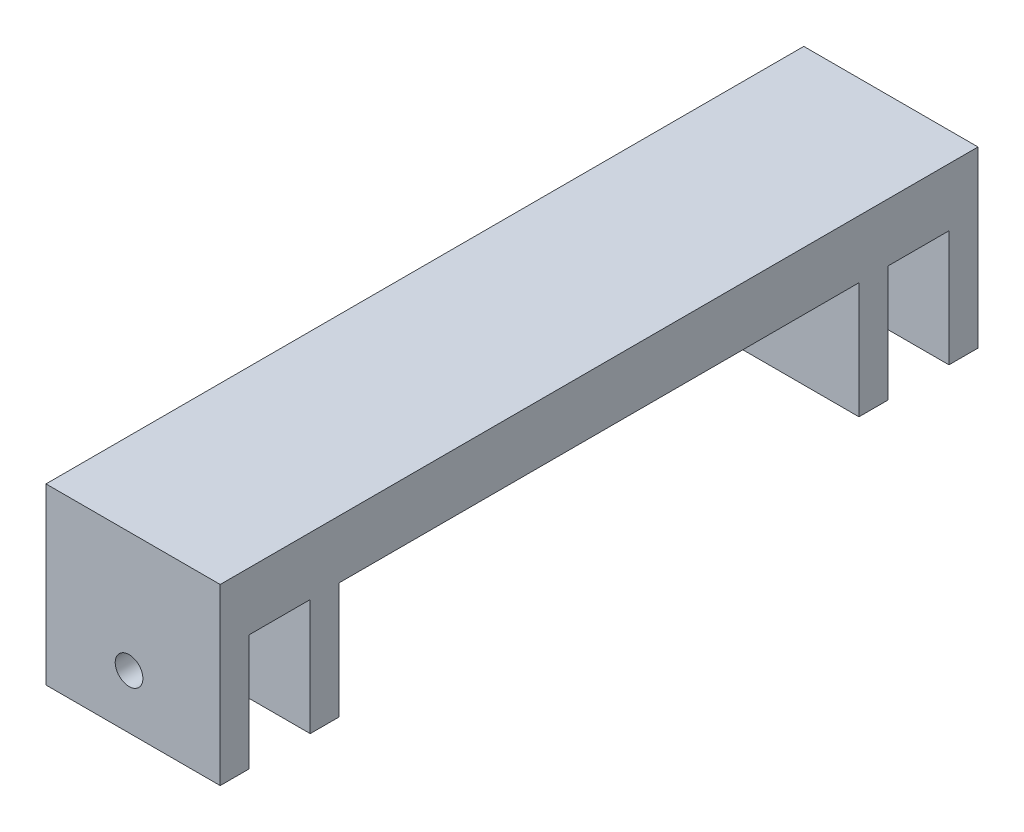
ISO-10303-21;
HEADER;
FILE_DESCRIPTION(('STEP AP214'),'2;1');
FILE_NAME('part.step','',(''),(''),'','','');
FILE_SCHEMA(('AUTOMOTIVE_DESIGN { 1 0 10303 214 1 1 1 1 }'));
ENDSEC;
DATA;
#1=APPLICATION_CONTEXT('core data for automotive mechanical design processes');
#2=APPLICATION_PROTOCOL_DEFINITION('international standard','automotive_design',2000,#1);
#3=PRODUCT_CONTEXT('',#1,'mechanical');
#4=PRODUCT('Part','Part','',(#3));
#5=PRODUCT_RELATED_PRODUCT_CATEGORY('part','',(#4));
#6=PRODUCT_DEFINITION_FORMATION('','',#4);
#7=PRODUCT_DEFINITION_CONTEXT('part definition',#1,'design');
#8=PRODUCT_DEFINITION('design','',#6,#7);
#9=PRODUCT_DEFINITION_SHAPE('','',#8);
#10=(LENGTH_UNIT() NAMED_UNIT(*) SI_UNIT(.MILLI.,.METRE.));
#11=(NAMED_UNIT(*) PLANE_ANGLE_UNIT() SI_UNIT($,.RADIAN.));
#12=(NAMED_UNIT(*) SI_UNIT($,.STERADIAN.) SOLID_ANGLE_UNIT());
#13=UNCERTAINTY_MEASURE_WITH_UNIT(LENGTH_MEASURE(1.E-05),#10,'distance_accuracy_value','');
#14=(GEOMETRIC_REPRESENTATION_CONTEXT(3) GLOBAL_UNCERTAINTY_ASSIGNED_CONTEXT((#13)) GLOBAL_UNIT_ASSIGNED_CONTEXT((#10,
#11,#12)) REPRESENTATION_CONTEXT('',''));
#15=CARTESIAN_POINT('',(0.,0.,0.));
#16=DIRECTION('',(0.,0.,1.));
#17=DIRECTION('',(1.,0.,0.));
#18=AXIS2_PLACEMENT_3D('',#15,#16,#17);
#19=CARTESIAN_POINT('',(0.,0.,130.5));
#20=DIRECTION('',(0.,1.,0.));
#21=DIRECTION('',(0.,0.,1.));
#22=AXIS2_PLACEMENT_3D('',#19,#20,#21);
#23=PLANE('',#22);
#24=DIRECTION('',(-1.,0.,0.));
#25=VECTOR('',#24,1.);
#26=CARTESIAN_POINT('',(30.,0.,115.));
#27=LINE('',#26,#25);
#28=CARTESIAN_POINT('',(30.,0.,115.));
#29=VERTEX_POINT('',#28);
#30=CARTESIAN_POINT('',(0.,0.,115.));
#31=VERTEX_POINT('',#30);
#32=EDGE_CURVE('E298',#29,#31,#27,.T.);
#33=ORIENTED_EDGE('',*,*,#32,.F.);
#34=DIRECTION('',(0.,0.,-1.));
#35=VECTOR('',#34,1.);
#36=CARTESIAN_POINT('',(30.,0.,130.5));
#37=LINE('',#36,#35);
#38=CARTESIAN_POINT('',(30.,0.,125.5));
#39=VERTEX_POINT('',#38);
#40=EDGE_CURVE('E173',#39,#29,#37,.T.);
#41=ORIENTED_EDGE('',*,*,#40,.F.);
#42=DIRECTION('',(1.,0.,0.));
#43=VECTOR('',#42,1.);
#44=CARTESIAN_POINT('',(0.,0.,125.5));
#45=LINE('',#44,#43);
#46=CARTESIAN_POINT('',(0.,0.,125.5));
#47=VERTEX_POINT('',#46);
#48=EDGE_CURVE('E174',#47,#39,#45,.T.);
#49=ORIENTED_EDGE('',*,*,#48,.F.);
#50=DIRECTION('',(0.,0.,-1.));
#51=VECTOR('',#50,1.);
#52=CARTESIAN_POINT('',(0.,0.,130.5));
#53=LINE('',#52,#51);
#54=EDGE_CURVE('E11',#47,#31,#53,.T.);
#55=ORIENTED_EDGE('',*,*,#54,.T.);
#56=EDGE_LOOP('',(#33,#41,#49,#55));
#57=FACE_BOUND('',#56,.T.);
#58=ADVANCED_FACE('F36',(#57),#23,.F.);
#59=DIRECTION('',(1.,0.,0.));
#60=VECTOR('',#59,1.);
#61=CARTESIAN_POINT('',(30.,0.,110.));
#62=LINE('',#61,#60);
#63=CARTESIAN_POINT('',(0.,0.,110.));
#64=VERTEX_POINT('',#63);
#65=CARTESIAN_POINT('',(30.,0.,110.));
#66=VERTEX_POINT('',#65);
#67=EDGE_CURVE('E167',#64,#66,#62,.T.);
#68=ORIENTED_EDGE('',*,*,#67,.F.);
#69=CARTESIAN_POINT('',(0.,0.,20.5));
#70=VERTEX_POINT('',#69);
#71=EDGE_CURVE('E45',#64,#70,#53,.T.);
#72=ORIENTED_EDGE('',*,*,#71,.T.);
#73=DIRECTION('',(-1.,0.,0.));
#74=VECTOR('',#73,1.);
#75=CARTESIAN_POINT('',(30.,0.,20.5));
#76=LINE('',#75,#74);
#77=CARTESIAN_POINT('',(30.,0.,20.5));
#78=VERTEX_POINT('',#77);
#79=EDGE_CURVE('E196',#78,#70,#76,.T.);
#80=ORIENTED_EDGE('',*,*,#79,.F.);
#81=EDGE_CURVE('E257',#66,#78,#37,.T.);
#82=ORIENTED_EDGE('',*,*,#81,.F.);
#83=EDGE_LOOP('',(#68,#72,#80,#82));
#84=FACE_BOUND('',#83,.T.);
#85=ADVANCED_FACE('F315',(#84),#23,.F.);
#86=DIRECTION('',(1.,0.,0.));
#87=VECTOR('',#86,1.);
#88=CARTESIAN_POINT('',(30.,0.,15.5));
#89=LINE('',#88,#87);
#90=CARTESIAN_POINT('',(0.,0.,15.5));
#91=VERTEX_POINT('',#90);
#92=CARTESIAN_POINT('',(30.,0.,15.5));
#93=VERTEX_POINT('',#92);
#94=EDGE_CURVE('E201',#91,#93,#89,.T.);
#95=ORIENTED_EDGE('',*,*,#94,.F.);
#96=CARTESIAN_POINT('',(0.,0.,5.));
#97=VERTEX_POINT('',#96);
#98=EDGE_CURVE('E46',#91,#97,#53,.T.);
#99=ORIENTED_EDGE('',*,*,#98,.T.);
#100=DIRECTION('',(-1.,0.,0.));
#101=VECTOR('',#100,1.);
#102=CARTESIAN_POINT('',(0.,0.,5.));
#103=LINE('',#102,#101);
#104=CARTESIAN_POINT('',(30.,0.,5.));
#105=VERTEX_POINT('',#104);
#106=EDGE_CURVE('E219',#105,#97,#103,.T.);
#107=ORIENTED_EDGE('',*,*,#106,.F.);
#108=EDGE_CURVE('E256',#93,#105,#37,.T.);
#109=ORIENTED_EDGE('',*,*,#108,.F.);
#110=EDGE_LOOP('',(#95,#99,#107,#109));
#111=FACE_BOUND('',#110,.T.);
#112=ADVANCED_FACE('F265',(#111),#23,.F.);
#113=CARTESIAN_POINT('',(0.,0.,130.5));
#114=DIRECTION('',(1.,0.,0.));
#115=DIRECTION('',(0.,0.,-1.));
#116=AXIS2_PLACEMENT_3D('',#113,#114,#115);
#117=PLANE('',#116);
#118=DIRECTION('',(0.,-1.,0.));
#119=VECTOR('',#118,1.);
#120=CARTESIAN_POINT('',(0.,0.,0.));
#121=LINE('',#120,#119);
#122=CARTESIAN_POINT('',(0.,10.,0.));
#123=VERTEX_POINT('',#122);
#124=CARTESIAN_POINT('',(0.,-20.,0.));
#125=VERTEX_POINT('',#124);
#126=EDGE_CURVE('E238',#123,#125,#121,.T.);
#127=ORIENTED_EDGE('',*,*,#126,.T.);
#128=DIRECTION('',(0.,0.,-1.));
#129=VECTOR('',#128,1.);
#130=CARTESIAN_POINT('',(0.,-20.,0.));
#131=LINE('',#130,#129);
#132=CARTESIAN_POINT('',(0.,-20.,5.));
#133=VERTEX_POINT('',#132);
#134=EDGE_CURVE('E220',#133,#125,#131,.T.);
#135=ORIENTED_EDGE('',*,*,#134,.F.);
#136=DIRECTION('',(0.,1.,0.));
#137=VECTOR('',#136,1.);
#138=CARTESIAN_POINT('',(0.,-20.,5.));
#139=LINE('',#138,#137);
#140=EDGE_CURVE('E230',#133,#97,#139,.T.);
#141=ORIENTED_EDGE('',*,*,#140,.T.);
#142=ORIENTED_EDGE('',*,*,#98,.F.);
#143=DIRECTION('',(0.,1.,0.));
#144=VECTOR('',#143,1.);
#145=CARTESIAN_POINT('',(0.,-20.,15.5));
#146=LINE('',#145,#144);
#147=CARTESIAN_POINT('',(0.,-20.,15.5));
#148=VERTEX_POINT('',#147);
#149=EDGE_CURVE('E211',#148,#91,#146,.T.);
#150=ORIENTED_EDGE('',*,*,#149,.F.);
#151=DIRECTION('',(0.,0.,-1.));
#152=VECTOR('',#151,1.);
#153=CARTESIAN_POINT('',(0.,-20.,15.5));
#154=LINE('',#153,#152);
#155=CARTESIAN_POINT('',(0.,-20.,20.5));
#156=VERTEX_POINT('',#155);
#157=EDGE_CURVE('E203',#156,#148,#154,.T.);
#158=ORIENTED_EDGE('',*,*,#157,.F.);
#159=DIRECTION('',(0.,1.,0.));
#160=VECTOR('',#159,1.);
#161=CARTESIAN_POINT('',(0.,-20.,20.5));
#162=LINE('',#161,#160);
#163=EDGE_CURVE('E213',#156,#70,#162,.T.);
#164=ORIENTED_EDGE('',*,*,#163,.T.);
#165=ORIENTED_EDGE('',*,*,#71,.F.);
#166=DIRECTION('',(0.,1.,0.));
#167=VECTOR('',#166,1.);
#168=CARTESIAN_POINT('',(0.,-20.,110.));
#169=LINE('',#168,#167);
#170=CARTESIAN_POINT('',(0.,-20.,110.));
#171=VERTEX_POINT('',#170);
#172=EDGE_CURVE('E178',#171,#64,#169,.T.);
#173=ORIENTED_EDGE('',*,*,#172,.F.);
#174=DIRECTION('',(0.,0.,-1.));
#175=VECTOR('',#174,1.);
#176=CARTESIAN_POINT('',(0.,-20.,115.));
#177=LINE('',#176,#175);
#178=CARTESIAN_POINT('',(0.,-20.,115.));
#179=VERTEX_POINT('',#178);
#180=EDGE_CURVE('E161',#179,#171,#177,.T.);
#181=ORIENTED_EDGE('',*,*,#180,.F.);
#182=DIRECTION('',(0.,1.,0.));
#183=VECTOR('',#182,1.);
#184=CARTESIAN_POINT('',(0.,-20.,115.));
#185=LINE('',#184,#183);
#186=EDGE_CURVE('E158',#179,#31,#185,.T.);
#187=ORIENTED_EDGE('',*,*,#186,.T.);
#188=ORIENTED_EDGE('',*,*,#54,.F.);
#189=DIRECTION('',(0.,1.,0.));
#190=VECTOR('',#189,1.);
#191=CARTESIAN_POINT('',(0.,-20.,125.5));
#192=LINE('',#191,#190);
#193=CARTESIAN_POINT('',(0.,-20.,125.5));
#194=VERTEX_POINT('',#193);
#195=EDGE_CURVE('E194',#194,#47,#192,.T.);
#196=ORIENTED_EDGE('',*,*,#195,.F.);
#197=DIRECTION('',(0.,0.,-1.));
#198=VECTOR('',#197,1.);
#199=CARTESIAN_POINT('',(0.,-20.,130.5));
#200=LINE('',#199,#198);
#201=CARTESIAN_POINT('',(0.,-20.,130.5));
#202=VERTEX_POINT('',#201);
#203=EDGE_CURVE('E176',#202,#194,#200,.T.);
#204=ORIENTED_EDGE('',*,*,#203,.F.);
#205=DIRECTION('',(0.,-1.,0.));
#206=VECTOR('',#205,1.);
#207=CARTESIAN_POINT('',(0.,0.,130.5));
#208=LINE('',#207,#206);
#209=CARTESIAN_POINT('',(0.,10.,130.5));
#210=VERTEX_POINT('',#209);
#211=EDGE_CURVE('E239',#210,#202,#208,.T.);
#212=ORIENTED_EDGE('',*,*,#211,.F.);
#213=DIRECTION('',(0.,0.,-1.));
#214=VECTOR('',#213,1.);
#215=CARTESIAN_POINT('',(0.,10.,130.5));
#216=LINE('',#215,#214);
#217=EDGE_CURVE('E246',#210,#123,#216,.T.);
#218=ORIENTED_EDGE('',*,*,#217,.T.);
#219=EDGE_LOOP('',(#127,#135,#141,#142,#150,#158,#164,#165,#173,#181,#187,#188,#196,#204,#212,#218));
#220=FACE_BOUND('',#219,.T.);
#221=ADVANCED_FACE('F38',(#220),#117,.F.);
#222=CARTESIAN_POINT('',(30.,0.,130.5));
#223=DIRECTION('',(-1.,0.,0.));
#224=DIRECTION('',(0.,0.,1.));
#225=AXIS2_PLACEMENT_3D('',#222,#223,#224);
#226=PLANE('',#225);
#227=DIRECTION('',(0.,1.,0.));
#228=VECTOR('',#227,1.);
#229=CARTESIAN_POINT('',(30.,0.,0.));
#230=LINE('',#229,#228);
#231=CARTESIAN_POINT('',(30.,-20.,0.));
#232=VERTEX_POINT('',#231);
#233=CARTESIAN_POINT('',(30.,10.,0.));
#234=VERTEX_POINT('',#233);
#235=EDGE_CURVE('E248',#232,#234,#230,.T.);
#236=ORIENTED_EDGE('',*,*,#235,.T.);
#237=DIRECTION('',(0.,0.,-1.));
#238=VECTOR('',#237,1.);
#239=CARTESIAN_POINT('',(30.,10.,130.5));
#240=LINE('',#239,#238);
#241=CARTESIAN_POINT('',(30.,10.,130.5));
#242=VERTEX_POINT('',#241);
#243=EDGE_CURVE('E253',#242,#234,#240,.T.);
#244=ORIENTED_EDGE('',*,*,#243,.F.);
#245=DIRECTION('',(0.,1.,0.));
#246=VECTOR('',#245,1.);
#247=CARTESIAN_POINT('',(30.,0.,130.5));
#248=LINE('',#247,#246);
#249=CARTESIAN_POINT('',(30.,-20.,130.5));
#250=VERTEX_POINT('',#249);
#251=EDGE_CURVE('E241',#250,#242,#248,.T.);
#252=ORIENTED_EDGE('',*,*,#251,.F.);
#253=DIRECTION('',(0.,0.,1.));
#254=VECTOR('',#253,1.);
#255=CARTESIAN_POINT('',(30.,-20.,130.5));
#256=LINE('',#255,#254);
#257=CARTESIAN_POINT('',(30.,-20.,125.5));
#258=VERTEX_POINT('',#257);
#259=EDGE_CURVE('E186',#258,#250,#256,.T.);
#260=ORIENTED_EDGE('',*,*,#259,.F.);
#261=DIRECTION('',(0.,1.,0.));
#262=VECTOR('',#261,1.);
#263=CARTESIAN_POINT('',(30.,-20.,125.5));
#264=LINE('',#263,#262);
#265=EDGE_CURVE('E191',#258,#39,#264,.T.);
#266=ORIENTED_EDGE('',*,*,#265,.T.);
#267=ORIENTED_EDGE('',*,*,#40,.T.);
#268=DIRECTION('',(0.,1.,0.));
#269=VECTOR('',#268,1.);
#270=CARTESIAN_POINT('',(30.,-20.,115.));
#271=LINE('',#270,#269);
#272=CARTESIAN_POINT('',(30.,-20.,115.));
#273=VERTEX_POINT('',#272);
#274=EDGE_CURVE('E155',#273,#29,#271,.T.);
#275=ORIENTED_EDGE('',*,*,#274,.F.);
#276=DIRECTION('',(0.,0.,1.));
#277=VECTOR('',#276,1.);
#278=CARTESIAN_POINT('',(30.,-20.,115.));
#279=LINE('',#278,#277);
#280=CARTESIAN_POINT('',(30.,-20.,110.));
#281=VERTEX_POINT('',#280);
#282=EDGE_CURVE('E162',#281,#273,#279,.T.);
#283=ORIENTED_EDGE('',*,*,#282,.F.);
#284=DIRECTION('',(0.,1.,0.));
#285=VECTOR('',#284,1.);
#286=CARTESIAN_POINT('',(30.,-20.,110.));
#287=LINE('',#286,#285);
#288=EDGE_CURVE('E53',#281,#66,#287,.T.);
#289=ORIENTED_EDGE('',*,*,#288,.T.);
#290=ORIENTED_EDGE('',*,*,#81,.T.);
#291=DIRECTION('',(0.,1.,0.));
#292=VECTOR('',#291,1.);
#293=CARTESIAN_POINT('',(30.,-20.,20.5));
#294=LINE('',#293,#292);
#295=CARTESIAN_POINT('',(30.,-20.,20.5));
#296=VERTEX_POINT('',#295);
#297=EDGE_CURVE('E216',#296,#78,#294,.T.);
#298=ORIENTED_EDGE('',*,*,#297,.F.);
#299=DIRECTION('',(0.,0.,1.));
#300=VECTOR('',#299,1.);
#301=CARTESIAN_POINT('',(30.,-20.,15.5));
#302=LINE('',#301,#300);
#303=CARTESIAN_POINT('',(30.,-20.,15.5));
#304=VERTEX_POINT('',#303);
#305=EDGE_CURVE('E197',#304,#296,#302,.T.);
#306=ORIENTED_EDGE('',*,*,#305,.F.);
#307=DIRECTION('',(0.,1.,0.));
#308=VECTOR('',#307,1.);
#309=CARTESIAN_POINT('',(30.,-20.,15.5));
#310=LINE('',#309,#308);
#311=EDGE_CURVE('E60',#304,#93,#310,.T.);
#312=ORIENTED_EDGE('',*,*,#311,.T.);
#313=ORIENTED_EDGE('',*,*,#108,.T.);
#314=DIRECTION('',(0.,1.,0.));
#315=VECTOR('',#314,1.);
#316=CARTESIAN_POINT('',(30.,-20.,5.));
#317=LINE('',#316,#315);
#318=CARTESIAN_POINT('',(30.,-20.,5.));
#319=VERTEX_POINT('',#318);
#320=EDGE_CURVE('E235',#319,#105,#317,.T.);
#321=ORIENTED_EDGE('',*,*,#320,.F.);
#322=DIRECTION('',(0.,0.,1.));
#323=VECTOR('',#322,1.);
#324=CARTESIAN_POINT('',(30.,-20.,0.));
#325=LINE('',#324,#323);
#326=EDGE_CURVE('E226',#232,#319,#325,.T.);
#327=ORIENTED_EDGE('',*,*,#326,.F.);
#328=EDGE_LOOP('',(#236,#244,#252,#260,#266,#267,#275,#283,#289,#290,#298,#306,#312,#313,#321,#327));
#329=FACE_BOUND('',#328,.T.);
#330=ADVANCED_FACE('F170',(#329),#226,.F.);
#331=CARTESIAN_POINT('',(0.,10.,130.5));
#332=DIRECTION('',(0.,-1.,0.));
#333=DIRECTION('',(0.,0.,-1.));
#334=AXIS2_PLACEMENT_3D('',#331,#332,#333);
#335=PLANE('',#334);
#336=DIRECTION('',(-1.,0.,0.));
#337=VECTOR('',#336,1.);
#338=CARTESIAN_POINT('',(0.,10.,0.));
#339=LINE('',#338,#337);
#340=EDGE_CURVE('E242',#234,#123,#339,.T.);
#341=ORIENTED_EDGE('',*,*,#340,.T.);
#342=ORIENTED_EDGE('',*,*,#217,.F.);
#343=DIRECTION('',(-1.,0.,0.));
#344=VECTOR('',#343,1.);
#345=CARTESIAN_POINT('',(0.,10.,130.5));
#346=LINE('',#345,#344);
#347=EDGE_CURVE('E244',#242,#210,#346,.T.);
#348=ORIENTED_EDGE('',*,*,#347,.F.);
#349=ORIENTED_EDGE('',*,*,#243,.T.);
#350=EDGE_LOOP('',(#341,#342,#348,#349));
#351=FACE_BOUND('',#350,.T.);
#352=ADVANCED_FACE('F279',(#351),#335,.F.);
#353=CARTESIAN_POINT('',(0.,0.,130.5));
#354=DIRECTION('',(0.,0.,-1.));
#355=DIRECTION('',(-1.,0.,0.));
#356=AXIS2_PLACEMENT_3D('',#353,#354,#355);
#357=PLANE('',#356);
#358=CARTESIAN_POINT('',(14.3021431152746,-10.6869098112044,130.5));
#359=DIRECTION('',(0.,0.,1.));
#360=DIRECTION('',(1.,0.,0.));
#361=AXIS2_PLACEMENT_3D('',#358,#359,#360);
#362=CIRCLE('',#361,2.38124999999999);
#363=CARTESIAN_POINT('',(16.6833931152746,-10.6869098112044,130.5));
#364=VERTEX_POINT('',#363);
#365=EDGE_CURVE('E550',#364,#364,#362,.T.);
#366=ORIENTED_EDGE('',*,*,#365,.F.);
#367=EDGE_LOOP('',(#366));
#368=FACE_BOUND('',#367,.T.);
#369=ORIENTED_EDGE('',*,*,#211,.T.);
#370=DIRECTION('',(-1.,0.,0.));
#371=VECTOR('',#370,1.);
#372=CARTESIAN_POINT('',(0.,-20.,130.5));
#373=LINE('',#372,#371);
#374=EDGE_CURVE('E189',#250,#202,#373,.T.);
#375=ORIENTED_EDGE('',*,*,#374,.F.);
#376=ORIENTED_EDGE('',*,*,#251,.T.);
#377=ORIENTED_EDGE('',*,*,#347,.T.);
#378=EDGE_LOOP('',(#369,#375,#376,#377));
#379=FACE_BOUND('',#378,.T.);
#380=ADVANCED_FACE('F289',(#368,#379),#357,.F.);
#381=CARTESIAN_POINT('',(0.,0.,0.));
#382=DIRECTION('',(0.,0.,-1.));
#383=DIRECTION('',(-1.,0.,0.));
#384=AXIS2_PLACEMENT_3D('',#381,#382,#383);
#385=PLANE('',#384);
#386=CARTESIAN_POINT('',(14.3021431152746,-10.6869098112044,0.));
#387=DIRECTION('',(0.,0.,1.));
#388=DIRECTION('',(1.,0.,0.));
#389=AXIS2_PLACEMENT_3D('',#386,#387,#388);
#390=CIRCLE('',#389,2.38124999999998);
#391=CARTESIAN_POINT('',(16.6833931152745,-10.6869098112044,0.));
#392=VERTEX_POINT('',#391);
#393=EDGE_CURVE('E548',#392,#392,#390,.T.);
#394=ORIENTED_EDGE('',*,*,#393,.T.);
#395=EDGE_LOOP('',(#394));
#396=FACE_BOUND('',#395,.T.);
#397=ORIENTED_EDGE('',*,*,#126,.F.);
#398=ORIENTED_EDGE('',*,*,#340,.F.);
#399=ORIENTED_EDGE('',*,*,#235,.F.);
#400=DIRECTION('',(1.,0.,0.));
#401=VECTOR('',#400,1.);
#402=CARTESIAN_POINT('',(0.,-20.,0.));
#403=LINE('',#402,#401);
#404=EDGE_CURVE('E223',#125,#232,#403,.T.);
#405=ORIENTED_EDGE('',*,*,#404,.F.);
#406=EDGE_LOOP('',(#397,#398,#399,#405));
#407=FACE_BOUND('',#406,.T.);
#408=ADVANCED_FACE('F282',(#396,#407),#385,.T.);
#409=CARTESIAN_POINT('',(0.,-20.,5.));
#410=DIRECTION('',(0.,0.,-1.));
#411=DIRECTION('',(-1.,0.,0.));
#412=AXIS2_PLACEMENT_3D('',#409,#410,#411);
#413=PLANE('',#412);
#414=CARTESIAN_POINT('',(14.3021431152746,-10.6869098112044,5.));
#415=DIRECTION('',(0.,0.,-1.));
#416=DIRECTION('',(-1.,0.,0.));
#417=AXIS2_PLACEMENT_3D('',#414,#415,#416);
#418=CIRCLE('',#417,2.38124999999999);
#419=CARTESIAN_POINT('',(11.9208931152746,-10.6869098112044,5.));
#420=VERTEX_POINT('',#419);
#421=EDGE_CURVE('E299',#420,#420,#418,.T.);
#422=ORIENTED_EDGE('',*,*,#421,.T.);
#423=EDGE_LOOP('',(#422));
#424=FACE_BOUND('',#423,.T.);
#425=ORIENTED_EDGE('',*,*,#106,.T.);
#426=ORIENTED_EDGE('',*,*,#140,.F.);
#427=DIRECTION('',(-1.,0.,0.));
#428=VECTOR('',#427,1.);
#429=CARTESIAN_POINT('',(0.,-20.,5.));
#430=LINE('',#429,#428);
#431=EDGE_CURVE('E228',#319,#133,#430,.T.);
#432=ORIENTED_EDGE('',*,*,#431,.F.);
#433=ORIENTED_EDGE('',*,*,#320,.T.);
#434=EDGE_LOOP('',(#425,#426,#432,#433));
#435=FACE_BOUND('',#434,.T.);
#436=ADVANCED_FACE('F269',(#424,#435),#413,.F.);
#437=CARTESIAN_POINT('',(0.,-20.,0.));
#438=DIRECTION('',(0.,1.,0.));
#439=DIRECTION('',(0.,0.,1.));
#440=AXIS2_PLACEMENT_3D('',#437,#438,#439);
#441=PLANE('',#440);
#442=ORIENTED_EDGE('',*,*,#134,.T.);
#443=ORIENTED_EDGE('',*,*,#404,.T.);
#444=ORIENTED_EDGE('',*,*,#326,.T.);
#445=ORIENTED_EDGE('',*,*,#431,.T.);
#446=EDGE_LOOP('',(#442,#443,#444,#445));
#447=FACE_BOUND('',#446,.T.);
#448=ADVANCED_FACE('F272',(#447),#441,.F.);
#449=CARTESIAN_POINT('',(30.,-20.,20.5));
#450=DIRECTION('',(0.,0.,-1.));
#451=DIRECTION('',(-1.,0.,0.));
#452=AXIS2_PLACEMENT_3D('',#449,#450,#451);
#453=PLANE('',#452);
#454=CARTESIAN_POINT('',(14.3021431152746,-10.6869098112044,20.5));
#455=DIRECTION('',(0.,0.,-1.));
#456=DIRECTION('',(-1.,0.,0.));
#457=AXIS2_PLACEMENT_3D('',#454,#455,#456);
#458=CIRCLE('',#457,2.38124999999999);
#459=CARTESIAN_POINT('',(11.9208931152746,-10.6869098112044,20.5));
#460=VERTEX_POINT('',#459);
#461=EDGE_CURVE('E558',#460,#460,#458,.T.);
#462=ORIENTED_EDGE('',*,*,#461,.T.);
#463=EDGE_LOOP('',(#462));
#464=FACE_BOUND('',#463,.T.);
#465=ORIENTED_EDGE('',*,*,#79,.T.);
#466=ORIENTED_EDGE('',*,*,#163,.F.);
#467=DIRECTION('',(-1.,0.,0.));
#468=VECTOR('',#467,1.);
#469=CARTESIAN_POINT('',(30.,-20.,20.5));
#470=LINE('',#469,#468);
#471=EDGE_CURVE('E200',#296,#156,#470,.T.);
#472=ORIENTED_EDGE('',*,*,#471,.F.);
#473=ORIENTED_EDGE('',*,*,#297,.T.);
#474=EDGE_LOOP('',(#465,#466,#472,#473));
#475=FACE_BOUND('',#474,.T.);
#476=ADVANCED_FACE('F321',(#464,#475),#453,.F.);
#477=CARTESIAN_POINT('',(30.,-20.,15.5));
#478=DIRECTION('',(0.,0.,1.));
#479=DIRECTION('',(1.,0.,0.));
#480=AXIS2_PLACEMENT_3D('',#477,#478,#479);
#481=PLANE('',#480);
#482=CARTESIAN_POINT('',(14.3021431152746,-10.6869098112044,15.5));
#483=DIRECTION('',(0.,0.,1.));
#484=DIRECTION('',(1.,0.,0.));
#485=AXIS2_PLACEMENT_3D('',#482,#483,#484);
#486=CIRCLE('',#485,2.38124999999999);
#487=CARTESIAN_POINT('',(16.6833931152746,-10.6869098112044,15.5));
#488=VERTEX_POINT('',#487);
#489=EDGE_CURVE('E553',#488,#488,#486,.T.);
#490=ORIENTED_EDGE('',*,*,#489,.T.);
#491=EDGE_LOOP('',(#490));
#492=FACE_BOUND('',#491,.T.);
#493=ORIENTED_EDGE('',*,*,#94,.T.);
#494=ORIENTED_EDGE('',*,*,#311,.F.);
#495=DIRECTION('',(1.,0.,0.));
#496=VECTOR('',#495,1.);
#497=CARTESIAN_POINT('',(30.,-20.,15.5));
#498=LINE('',#497,#496);
#499=EDGE_CURVE('E205',#148,#304,#498,.T.);
#500=ORIENTED_EDGE('',*,*,#499,.F.);
#501=ORIENTED_EDGE('',*,*,#149,.T.);
#502=EDGE_LOOP('',(#493,#494,#500,#501));
#503=FACE_BOUND('',#502,.T.);
#504=ADVANCED_FACE('F327',(#492,#503),#481,.F.);
#505=CARTESIAN_POINT('',(0.,-20.,0.));
#506=DIRECTION('',(0.,-1.,0.));
#507=DIRECTION('',(0.,0.,-1.));
#508=AXIS2_PLACEMENT_3D('',#505,#506,#507);
#509=PLANE('',#508);
#510=ORIENTED_EDGE('',*,*,#305,.T.);
#511=ORIENTED_EDGE('',*,*,#471,.T.);
#512=ORIENTED_EDGE('',*,*,#157,.T.);
#513=ORIENTED_EDGE('',*,*,#499,.T.);
#514=EDGE_LOOP('',(#510,#511,#512,#513));
#515=FACE_BOUND('',#514,.T.);
#516=ADVANCED_FACE('F324',(#515),#509,.T.);
#517=CARTESIAN_POINT('',(0.,-20.,125.5));
#518=DIRECTION('',(0.,0.,1.));
#519=DIRECTION('',(1.,0.,0.));
#520=AXIS2_PLACEMENT_3D('',#517,#518,#519);
#521=PLANE('',#520);
#522=CARTESIAN_POINT('',(14.3021431152746,-10.6869098112044,125.5));
#523=DIRECTION('',(0.,0.,1.));
#524=DIRECTION('',(1.,0.,0.));
#525=AXIS2_PLACEMENT_3D('',#522,#523,#524);
#526=CIRCLE('',#525,2.38124999999999);
#527=CARTESIAN_POINT('',(16.6833931152746,-10.6869098112044,125.5));
#528=VERTEX_POINT('',#527);
#529=EDGE_CURVE('E303',#528,#528,#526,.T.);
#530=ORIENTED_EDGE('',*,*,#529,.T.);
#531=EDGE_LOOP('',(#530));
#532=FACE_BOUND('',#531,.T.);
#533=ORIENTED_EDGE('',*,*,#48,.T.);
#534=ORIENTED_EDGE('',*,*,#265,.F.);
#535=DIRECTION('',(1.,0.,0.));
#536=VECTOR('',#535,1.);
#537=CARTESIAN_POINT('',(0.,-20.,125.5));
#538=LINE('',#537,#536);
#539=EDGE_CURVE('E184',#194,#258,#538,.T.);
#540=ORIENTED_EDGE('',*,*,#539,.F.);
#541=ORIENTED_EDGE('',*,*,#195,.T.);
#542=EDGE_LOOP('',(#533,#534,#540,#541));
#543=FACE_BOUND('',#542,.T.);
#544=ADVANCED_FACE('F335',(#532,#543),#521,.F.);
#545=CARTESIAN_POINT('',(0.,-20.,0.));
#546=DIRECTION('',(0.,-1.,0.));
#547=DIRECTION('',(0.,0.,-1.));
#548=AXIS2_PLACEMENT_3D('',#545,#546,#547);
#549=PLANE('',#548);
#550=ORIENTED_EDGE('',*,*,#203,.T.);
#551=ORIENTED_EDGE('',*,*,#539,.T.);
#552=ORIENTED_EDGE('',*,*,#259,.T.);
#553=ORIENTED_EDGE('',*,*,#374,.T.);
#554=EDGE_LOOP('',(#550,#551,#552,#553));
#555=FACE_BOUND('',#554,.T.);
#556=ADVANCED_FACE('F291',(#555),#549,.T.);
#557=CARTESIAN_POINT('',(30.,-20.,115.));
#558=DIRECTION('',(0.,0.,-1.));
#559=DIRECTION('',(-1.,0.,0.));
#560=AXIS2_PLACEMENT_3D('',#557,#558,#559);
#561=PLANE('',#560);
#562=CARTESIAN_POINT('',(14.3021431152746,-10.6869098112044,115.));
#563=DIRECTION('',(0.,0.,-1.));
#564=DIRECTION('',(-1.,0.,0.));
#565=AXIS2_PLACEMENT_3D('',#562,#563,#564);
#566=CIRCLE('',#565,2.38124999999999);
#567=CARTESIAN_POINT('',(11.9208931152746,-10.6869098112044,115.));
#568=VERTEX_POINT('',#567);
#569=EDGE_CURVE('E561',#568,#568,#566,.T.);
#570=ORIENTED_EDGE('',*,*,#569,.T.);
#571=EDGE_LOOP('',(#570));
#572=FACE_BOUND('',#571,.T.);
#573=ORIENTED_EDGE('',*,*,#32,.T.);
#574=ORIENTED_EDGE('',*,*,#186,.F.);
#575=DIRECTION('',(-1.,0.,0.));
#576=VECTOR('',#575,1.);
#577=CARTESIAN_POINT('',(30.,-20.,115.));
#578=LINE('',#577,#576);
#579=EDGE_CURVE('E151',#273,#179,#578,.T.);
#580=ORIENTED_EDGE('',*,*,#579,.F.);
#581=ORIENTED_EDGE('',*,*,#274,.T.);
#582=EDGE_LOOP('',(#573,#574,#580,#581));
#583=FACE_BOUND('',#582,.T.);
#584=ADVANCED_FACE('F153',(#572,#583),#561,.F.);
#585=CARTESIAN_POINT('',(30.,-20.,110.));
#586=DIRECTION('',(0.,0.,1.));
#587=DIRECTION('',(1.,0.,0.));
#588=AXIS2_PLACEMENT_3D('',#585,#586,#587);
#589=PLANE('',#588);
#590=CARTESIAN_POINT('',(14.3021431152746,-10.6869098112044,110.));
#591=DIRECTION('',(0.,0.,1.));
#592=DIRECTION('',(1.,0.,0.));
#593=AXIS2_PLACEMENT_3D('',#590,#591,#592);
#594=CIRCLE('',#593,2.38124999999999);
#595=CARTESIAN_POINT('',(16.6833931152746,-10.6869098112044,110.));
#596=VERTEX_POINT('',#595);
#597=EDGE_CURVE('E40',#596,#596,#594,.T.);
#598=ORIENTED_EDGE('',*,*,#597,.T.);
#599=EDGE_LOOP('',(#598));
#600=FACE_BOUND('',#599,.T.);
#601=ORIENTED_EDGE('',*,*,#67,.T.);
#602=ORIENTED_EDGE('',*,*,#288,.F.);
#603=DIRECTION('',(1.,0.,0.));
#604=VECTOR('',#603,1.);
#605=CARTESIAN_POINT('',(30.,-20.,110.));
#606=LINE('',#605,#604);
#607=EDGE_CURVE('E166',#171,#281,#606,.T.);
#608=ORIENTED_EDGE('',*,*,#607,.F.);
#609=ORIENTED_EDGE('',*,*,#172,.T.);
#610=EDGE_LOOP('',(#601,#602,#608,#609));
#611=FACE_BOUND('',#610,.T.);
#612=ADVANCED_FACE('F311',(#600,#611),#589,.F.);
#613=CARTESIAN_POINT('',(0.,-20.,0.));
#614=DIRECTION('',(0.,1.,0.));
#615=DIRECTION('',(0.,0.,1.));
#616=AXIS2_PLACEMENT_3D('',#613,#614,#615);
#617=PLANE('',#616);
#618=ORIENTED_EDGE('',*,*,#282,.T.);
#619=ORIENTED_EDGE('',*,*,#579,.T.);
#620=ORIENTED_EDGE('',*,*,#180,.T.);
#621=ORIENTED_EDGE('',*,*,#607,.T.);
#622=EDGE_LOOP('',(#618,#619,#620,#621));
#623=FACE_BOUND('',#622,.T.);
#624=ADVANCED_FACE('F164',(#623),#617,.F.);
#625=CARTESIAN_POINT('',(14.3021431152746,-10.6869098112044,130.5));
#626=DIRECTION('',(0.,0.,1.));
#627=DIRECTION('',(1.,0.,0.));
#628=AXIS2_PLACEMENT_3D('',#625,#626,#627);
#629=CYLINDRICAL_SURFACE('',#628,2.38124999999999);
#630=ORIENTED_EDGE('',*,*,#597,.F.);
#631=EDGE_LOOP('',(#630));
#632=FACE_BOUND('',#631,.T.);
#633=ORIENTED_EDGE('',*,*,#569,.F.);
#634=EDGE_LOOP('',(#633));
#635=FACE_BOUND('',#634,.T.);
#636=ADVANCED_FACE('F420',(#632,#635),#629,.F.);
#637=ORIENTED_EDGE('',*,*,#489,.F.);
#638=EDGE_LOOP('',(#637));
#639=FACE_BOUND('',#638,.T.);
#640=ORIENTED_EDGE('',*,*,#461,.F.);
#641=EDGE_LOOP('',(#640));
#642=FACE_BOUND('',#641,.T.);
#643=ADVANCED_FACE('F425',(#639,#642),#629,.F.);
#644=ORIENTED_EDGE('',*,*,#365,.T.);
#645=EDGE_LOOP('',(#644));
#646=FACE_BOUND('',#645,.T.);
#647=ORIENTED_EDGE('',*,*,#529,.F.);
#648=EDGE_LOOP('',(#647));
#649=FACE_BOUND('',#648,.T.);
#650=ADVANCED_FACE('F428',(#646,#649),#629,.F.);
#651=ORIENTED_EDGE('',*,*,#393,.F.);
#652=EDGE_LOOP('',(#651));
#653=FACE_BOUND('',#652,.T.);
#654=ORIENTED_EDGE('',*,*,#421,.F.);
#655=EDGE_LOOP('',(#654));
#656=FACE_BOUND('',#655,.T.);
#657=ADVANCED_FACE('F437',(#653,#656),#629,.F.);
#658=CLOSED_SHELL('',(#58,#85,#112,#221,#330,#352,#380,#408,#436,#448,#476,#504,#516,#544,#556,
#584,#612,#624,#636,#643,#650,#657));
#659=MANIFOLD_SOLID_BREP('B2',#658);
#660=ADVANCED_BREP_SHAPE_REPRESENTATION('',(#18,#659),#14);
#661=SHAPE_DEFINITION_REPRESENTATION(#9,#660);
ENDSEC;
END-ISO-10303-21;
